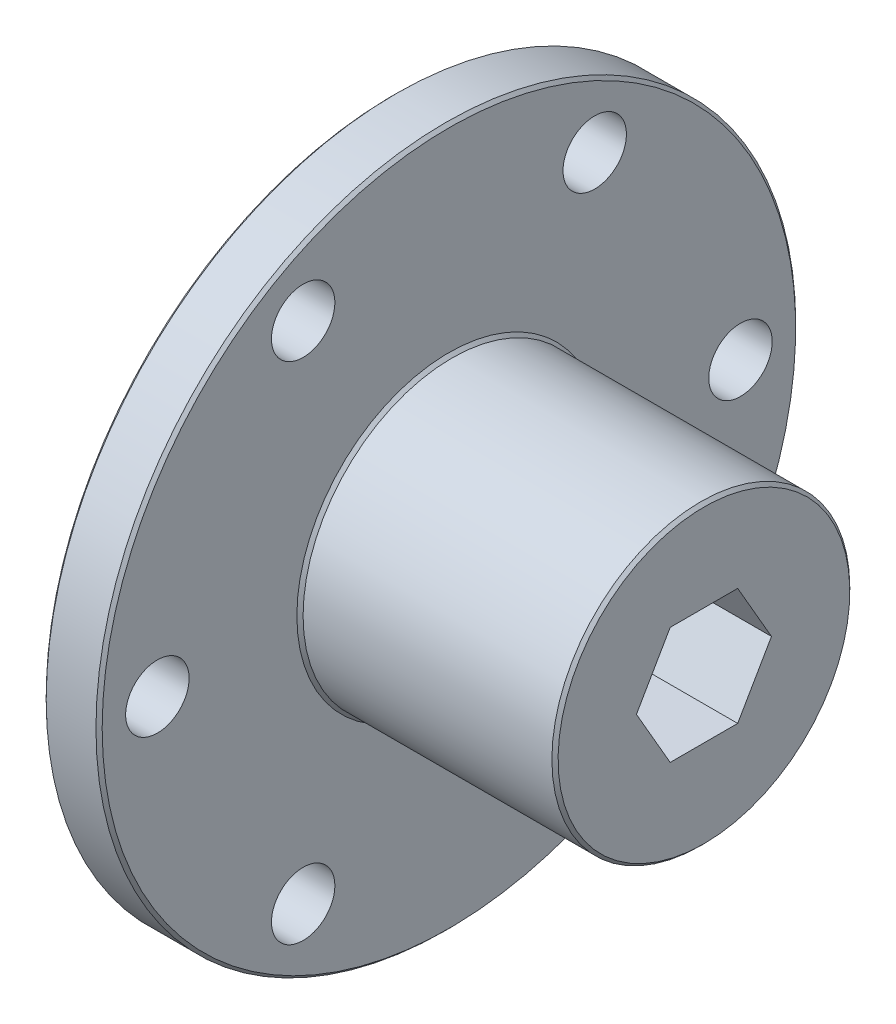
ISO-10303-21;
HEADER;
FILE_DESCRIPTION(('STEP AP214'),'2;1');
FILE_NAME('part.step','',(''),(''),'','','');
FILE_SCHEMA(('AUTOMOTIVE_DESIGN { 1 0 10303 214 1 1 1 1 }'));
ENDSEC;
DATA;
#1=APPLICATION_CONTEXT('core data for automotive mechanical design processes');
#2=APPLICATION_PROTOCOL_DEFINITION('international standard','automotive_design',2000,#1);
#3=PRODUCT_CONTEXT('',#1,'mechanical');
#4=PRODUCT('Part','Part','',(#3));
#5=PRODUCT_RELATED_PRODUCT_CATEGORY('part','',(#4));
#6=PRODUCT_DEFINITION_FORMATION('','',#4);
#7=PRODUCT_DEFINITION_CONTEXT('part definition',#1,'design');
#8=PRODUCT_DEFINITION('design','',#6,#7);
#9=PRODUCT_DEFINITION_SHAPE('','',#8);
#10=(LENGTH_UNIT() NAMED_UNIT(*) SI_UNIT(.MILLI.,.METRE.));
#11=(NAMED_UNIT(*) PLANE_ANGLE_UNIT() SI_UNIT($,.RADIAN.));
#12=(NAMED_UNIT(*) SI_UNIT($,.STERADIAN.) SOLID_ANGLE_UNIT());
#13=UNCERTAINTY_MEASURE_WITH_UNIT(LENGTH_MEASURE(1.E-05),#10,'distance_accuracy_value','');
#14=(GEOMETRIC_REPRESENTATION_CONTEXT(3) GLOBAL_UNCERTAINTY_ASSIGNED_CONTEXT((#13)) GLOBAL_UNIT_ASSIGNED_CONTEXT((#10,
#11,#12)) REPRESENTATION_CONTEXT('',''));
#15=CARTESIAN_POINT('',(0.,0.,0.));
#16=DIRECTION('',(0.,0.,1.));
#17=DIRECTION('',(1.,0.,0.));
#18=AXIS2_PLACEMENT_3D('',#15,#16,#17);
#19=CARTESIAN_POINT('',(7.79293375394323,0.,0.));
#20=DIRECTION('',(-1.,0.,0.));
#21=DIRECTION('',(0.,0.,1.));
#22=AXIS2_PLACEMENT_3D('',#19,#20,#21);
#23=CYLINDRICAL_SURFACE('',#22,12.1666);
#24=CARTESIAN_POINT('',(7.53893375394325,0.,0.));
#25=DIRECTION('',(-1.,0.,0.));
#26=DIRECTION('',(0.,0.,1.));
#27=AXIS2_PLACEMENT_3D('',#24,#25,#26);
#28=CIRCLE('',#27,12.1666);
#29=CARTESIAN_POINT('',(7.53893375394325,0.,12.1666));
#30=VERTEX_POINT('',#29);
#31=EDGE_CURVE('E105',#30,#30,#28,.F.);
#32=ORIENTED_EDGE('',*,*,#31,.F.);
#33=EDGE_LOOP('',(#32));
#34=FACE_BOUND('',#33,.T.);
#35=CARTESIAN_POINT('',(-12.7810662460568,0.,0.));
#36=DIRECTION('',(-1.,0.,0.));
#37=DIRECTION('',(0.,0.,1.));
#38=AXIS2_PLACEMENT_3D('',#35,#36,#37);
#39=CIRCLE('',#38,12.1666);
#40=CARTESIAN_POINT('',(-12.7810662460568,0.,12.1666));
#41=VERTEX_POINT('',#40);
#42=EDGE_CURVE('E102',#41,#41,#39,.T.);
#43=ORIENTED_EDGE('',*,*,#42,.F.);
#44=EDGE_LOOP('',(#43));
#45=FACE_BOUND('',#44,.T.);
#46=ADVANCED_FACE('F16',(#34,#45),#23,.T.);
#47=CARTESIAN_POINT('',(7.53893375394325,0.,0.));
#48=DIRECTION('',(-1.,0.,0.));
#49=DIRECTION('',(0.,-1.,0.));
#50=AXIS2_PLACEMENT_3D('',#47,#48,#49);
#51=CONICAL_SURFACE('',#50,12.1666,0.785398163397443);
#52=ORIENTED_EDGE('',*,*,#31,.T.);
#53=EDGE_LOOP('',(#52));
#54=FACE_BOUND('',#53,.T.);
#55=CARTESIAN_POINT('',(7.79293375394323,0.,0.));
#56=DIRECTION('',(-1.,0.,0.));
#57=DIRECTION('',(0.,-1.,0.));
#58=AXIS2_PLACEMENT_3D('',#55,#56,#57);
#59=CIRCLE('',#58,11.9126);
#60=CARTESIAN_POINT('',(7.79293375394323,-11.9126,0.));
#61=VERTEX_POINT('',#60);
#62=EDGE_CURVE('E19',#61,#61,#59,.F.);
#63=ORIENTED_EDGE('',*,*,#62,.F.);
#64=EDGE_LOOP('',(#63));
#65=FACE_BOUND('',#64,.T.);
#66=ADVANCED_FACE('F154',(#54,#65),#51,.T.);
#67=CARTESIAN_POINT('',(-13.2890662460568,0.,0.));
#68=DIRECTION('',(-1.,0.,0.));
#69=DIRECTION('',(0.,0.,1.));
#70=AXIS2_PLACEMENT_3D('',#67,#68,#69);
#71=CONICAL_SURFACE('',#70,28.575,0.785398163397442);
#72=CARTESIAN_POINT('',(-13.2890662460568,0.,0.));
#73=DIRECTION('',(-1.,0.,0.));
#74=DIRECTION('',(0.,0.,1.));
#75=AXIS2_PLACEMENT_3D('',#72,#73,#74);
#76=CIRCLE('',#75,28.575);
#77=CARTESIAN_POINT('',(-13.2890662460568,0.,28.575));
#78=VERTEX_POINT('',#77);
#79=EDGE_CURVE('E99',#78,#78,#76,.T.);
#80=ORIENTED_EDGE('',*,*,#79,.F.);
#81=EDGE_LOOP('',(#80));
#82=FACE_BOUND('',#81,.T.);
#83=CARTESIAN_POINT('',(-13.0350662460568,0.,0.));
#84=DIRECTION('',(-1.,0.,0.));
#85=DIRECTION('',(0.,0.,1.));
#86=AXIS2_PLACEMENT_3D('',#83,#84,#85);
#87=CIRCLE('',#86,28.321);
#88=CARTESIAN_POINT('',(-13.0350662460568,0.,28.321));
#89=VERTEX_POINT('',#88);
#90=EDGE_CURVE('E147',#89,#89,#87,.F.);
#91=ORIENTED_EDGE('',*,*,#90,.F.);
#92=EDGE_LOOP('',(#91));
#93=FACE_BOUND('',#92,.T.);
#94=ADVANCED_FACE('F156',(#82,#93),#71,.T.);
#95=CARTESIAN_POINT('',(-13.0350662460568,0.,0.));
#96=DIRECTION('',(-1.,0.,0.));
#97=DIRECTION('',(0.,0.,1.));
#98=AXIS2_PLACEMENT_3D('',#95,#96,#97);
#99=CONICAL_SURFACE('',#98,12.4206,0.785398163397448);
#100=ORIENTED_EDGE('',*,*,#42,.T.);
#101=EDGE_LOOP('',(#100));
#102=FACE_BOUND('',#101,.T.);
#103=CARTESIAN_POINT('',(-13.0350662460568,0.,0.));
#104=DIRECTION('',(-1.,0.,0.));
#105=DIRECTION('',(0.,0.,1.));
#106=AXIS2_PLACEMENT_3D('',#103,#104,#105);
#107=CIRCLE('',#106,12.4206);
#108=CARTESIAN_POINT('',(-13.0350662460568,0.,12.4206));
#109=VERTEX_POINT('',#108);
#110=EDGE_CURVE('E98',#109,#109,#107,.T.);
#111=ORIENTED_EDGE('',*,*,#110,.F.);
#112=EDGE_LOOP('',(#111));
#113=FACE_BOUND('',#112,.T.);
#114=ADVANCED_FACE('F163',(#102,#113),#99,.T.);
#115=CARTESIAN_POINT('',(-13.0350662460568,0.,0.));
#116=DIRECTION('',(-1.,0.,0.));
#117=DIRECTION('',(0.,0.,1.));
#118=AXIS2_PLACEMENT_3D('',#115,#116,#117);
#119=CYLINDRICAL_SURFACE('',#118,28.575);
#120=CARTESIAN_POINT('',(-17.3530662460568,0.,0.));
#121=DIRECTION('',(1.,0.,0.));
#122=DIRECTION('',(0.,0.,-1.));
#123=AXIS2_PLACEMENT_3D('',#120,#121,#122);
#124=CIRCLE('',#123,28.575);
#125=CARTESIAN_POINT('',(-17.3530662460568,0.,-28.575));
#126=VERTEX_POINT('',#125);
#127=EDGE_CURVE('E80',#126,#126,#124,.F.);
#128=ORIENTED_EDGE('',*,*,#127,.F.);
#129=EDGE_LOOP('',(#128));
#130=FACE_BOUND('',#129,.T.);
#131=ORIENTED_EDGE('',*,*,#79,.T.);
#132=EDGE_LOOP('',(#131));
#133=FACE_BOUND('',#132,.T.);
#134=ADVANCED_FACE('F229',(#130,#133),#119,.T.);
#135=CARTESIAN_POINT('',(7.79293375394323,0.,0.));
#136=DIRECTION('',(1.,0.,0.));
#137=DIRECTION('',(0.,0.,-1.));
#138=AXIS2_PLACEMENT_3D('',#135,#136,#137);
#139=PLANE('',#138);
#140=DIRECTION('',(0.,0.866025403784438,0.500000000000001));
#141=VECTOR('',#140,1.);
#142=CARTESIAN_POINT('',(7.79293375394324,0.,-5.5139260108686));
#143=LINE('',#142,#141);
#144=CARTESIAN_POINT('',(7.79293375394324,4.7752,-2.7569630054343));
#145=VERTEX_POINT('',#144);
#146=CARTESIAN_POINT('',(7.79293375394323,0.,-5.5139260108686));
#147=VERTEX_POINT('',#146);
#148=EDGE_CURVE('E85',#145,#147,#143,.F.);
#149=ORIENTED_EDGE('',*,*,#148,.T.);
#150=DIRECTION('',(0.,0.866025403784439,-0.5));
#151=VECTOR('',#150,1.);
#152=CARTESIAN_POINT('',(7.79293375394323,-4.7752,-2.7569630054343));
#153=LINE('',#152,#151);
#154=CARTESIAN_POINT('',(7.79293375394323,-4.7752,-2.7569630054343));
#155=VERTEX_POINT('',#154);
#156=EDGE_CURVE('E66',#147,#155,#153,.F.);
#157=ORIENTED_EDGE('',*,*,#156,.T.);
#158=DIRECTION('',(0.,0.,-1.));
#159=VECTOR('',#158,1.);
#160=CARTESIAN_POINT('',(7.79293375394323,-4.7752,2.7569630054343));
#161=LINE('',#160,#159);
#162=CARTESIAN_POINT('',(7.79293375394323,-4.7752,2.7569630054343));
#163=VERTEX_POINT('',#162);
#164=EDGE_CURVE('E71',#155,#163,#161,.F.);
#165=ORIENTED_EDGE('',*,*,#164,.T.);
#166=DIRECTION('',(0.,-0.866025403784439,-0.5));
#167=VECTOR('',#166,1.);
#168=CARTESIAN_POINT('',(7.79293375394323,0.,5.5139260108686));
#169=LINE('',#168,#167);
#170=CARTESIAN_POINT('',(7.79293375394323,0.,5.5139260108686));
#171=VERTEX_POINT('',#170);
#172=EDGE_CURVE('E145',#163,#171,#169,.F.);
#173=ORIENTED_EDGE('',*,*,#172,.T.);
#174=DIRECTION('',(0.,-0.866025403784439,0.5));
#175=VECTOR('',#174,1.);
#176=CARTESIAN_POINT('',(7.79293375394323,4.7752,2.7569630054343));
#177=LINE('',#176,#175);
#178=CARTESIAN_POINT('',(7.79293375394323,4.7752,2.7569630054343));
#179=VERTEX_POINT('',#178);
#180=EDGE_CURVE('E414',#171,#179,#177,.F.);
#181=ORIENTED_EDGE('',*,*,#180,.T.);
#182=DIRECTION('',(0.,0.,1.));
#183=VECTOR('',#182,1.);
#184=CARTESIAN_POINT('',(7.79293375394323,4.7752,-2.7569630054343));
#185=LINE('',#184,#183);
#186=EDGE_CURVE('E419',#179,#145,#185,.F.);
#187=ORIENTED_EDGE('',*,*,#186,.T.);
#188=EDGE_LOOP('',(#149,#157,#165,#173,#181,#187));
#189=FACE_BOUND('',#188,.T.);
#190=ORIENTED_EDGE('',*,*,#62,.T.);
#191=EDGE_LOOP('',(#190));
#192=FACE_BOUND('',#191,.T.);
#193=ADVANCED_FACE('F82',(#189,#192),#139,.T.);
#194=CARTESIAN_POINT('',(-13.0350662460568,28.575,0.));
#195=DIRECTION('',(1.,0.,0.));
#196=DIRECTION('',(0.,0.,-1.));
#197=AXIS2_PLACEMENT_3D('',#194,#195,#196);
#198=PLANE('',#197);
#199=CARTESIAN_POINT('',(-13.0350662460568,0.,23.8125));
#200=DIRECTION('',(1.,0.,0.));
#201=DIRECTION('',(0.,0.,-1.));
#202=AXIS2_PLACEMENT_3D('',#199,#200,#201);
#203=CIRCLE('',#202,2.59080000000001);
#204=CARTESIAN_POINT('',(-13.0350662460568,0.,21.2217));
#205=VERTEX_POINT('',#204);
#206=EDGE_CURVE('E127',#205,#205,#203,.F.);
#207=ORIENTED_EDGE('',*,*,#206,.T.);
#208=EDGE_LOOP('',(#207));
#209=FACE_BOUND('',#208,.T.);
#210=CARTESIAN_POINT('',(-13.0350662460568,20.6222299276169,11.90625));
#211=DIRECTION('',(1.,0.,0.));
#212=DIRECTION('',(0.,0.,-1.));
#213=AXIS2_PLACEMENT_3D('',#210,#211,#212);
#214=CIRCLE('',#213,2.59080000000001);
#215=CARTESIAN_POINT('',(-13.0350662460568,20.6222299276169,9.31544999999999));
#216=VERTEX_POINT('',#215);
#217=EDGE_CURVE('E130',#216,#216,#214,.F.);
#218=ORIENTED_EDGE('',*,*,#217,.T.);
#219=EDGE_LOOP('',(#218));
#220=FACE_BOUND('',#219,.T.);
#221=CARTESIAN_POINT('',(-13.0350662460568,20.622229927617,-11.90625));
#222=DIRECTION('',(1.,0.,0.));
#223=DIRECTION('',(0.,0.,-1.));
#224=AXIS2_PLACEMENT_3D('',#221,#222,#223);
#225=CIRCLE('',#224,2.59080000000001);
#226=CARTESIAN_POINT('',(-13.0350662460568,20.622229927617,-14.49705));
#227=VERTEX_POINT('',#226);
#228=EDGE_CURVE('E133',#227,#227,#225,.F.);
#229=ORIENTED_EDGE('',*,*,#228,.T.);
#230=EDGE_LOOP('',(#229));
#231=FACE_BOUND('',#230,.T.);
#232=CARTESIAN_POINT('',(-13.0350662460568,0.,-23.8125));
#233=DIRECTION('',(1.,0.,0.));
#234=DIRECTION('',(0.,0.,-1.));
#235=AXIS2_PLACEMENT_3D('',#232,#233,#234);
#236=CIRCLE('',#235,2.59080000000001);
#237=CARTESIAN_POINT('',(-13.0350662460568,0.,-26.4033));
#238=VERTEX_POINT('',#237);
#239=EDGE_CURVE('E136',#238,#238,#236,.F.);
#240=ORIENTED_EDGE('',*,*,#239,.T.);
#241=EDGE_LOOP('',(#240));
#242=FACE_BOUND('',#241,.T.);
#243=CARTESIAN_POINT('',(-13.0350662460568,-20.6222299276169,-11.90625));
#244=DIRECTION('',(1.,0.,0.));
#245=DIRECTION('',(0.,0.,-1.));
#246=AXIS2_PLACEMENT_3D('',#243,#244,#245);
#247=CIRCLE('',#246,2.59080000000001);
#248=CARTESIAN_POINT('',(-13.0350662460568,-20.6222299276169,-14.4970500000001));
#249=VERTEX_POINT('',#248);
#250=EDGE_CURVE('E139',#249,#249,#247,.F.);
#251=ORIENTED_EDGE('',*,*,#250,.T.);
#252=EDGE_LOOP('',(#251));
#253=FACE_BOUND('',#252,.T.);
#254=CARTESIAN_POINT('',(-13.0350662460568,-20.622229927617,11.9062499999999));
#255=DIRECTION('',(1.,0.,0.));
#256=DIRECTION('',(0.,0.,-1.));
#257=AXIS2_PLACEMENT_3D('',#254,#255,#256);
#258=CIRCLE('',#257,2.59080000000001);
#259=CARTESIAN_POINT('',(-13.0350662460568,-20.622229927617,9.31544999999993));
#260=VERTEX_POINT('',#259);
#261=EDGE_CURVE('E142',#260,#260,#258,.F.);
#262=ORIENTED_EDGE('',*,*,#261,.T.);
#263=EDGE_LOOP('',(#262));
#264=FACE_BOUND('',#263,.T.);
#265=ORIENTED_EDGE('',*,*,#110,.T.);
#266=EDGE_LOOP('',(#265));
#267=FACE_BOUND('',#266,.T.);
#268=ORIENTED_EDGE('',*,*,#90,.T.);
#269=EDGE_LOOP('',(#268));
#270=FACE_BOUND('',#269,.T.);
#271=ADVANCED_FACE('F222',(#209,#220,#231,#242,#253,#264,#267,#270),#198,.T.);
#272=CARTESIAN_POINT('',(-17.3530662460568,0.,0.));
#273=DIRECTION('',(1.,0.,0.));
#274=DIRECTION('',(0.,0.,-1.));
#275=AXIS2_PLACEMENT_3D('',#272,#273,#274);
#276=CONICAL_SURFACE('',#275,28.575,0.785398163397455);
#277=ORIENTED_EDGE('',*,*,#127,.T.);
#278=EDGE_LOOP('',(#277));
#279=FACE_BOUND('',#278,.T.);
#280=CARTESIAN_POINT('',(-17.6070662460568,0.,0.));
#281=DIRECTION('',(1.,0.,0.));
#282=DIRECTION('',(0.,0.,-1.));
#283=AXIS2_PLACEMENT_3D('',#280,#281,#282);
#284=CIRCLE('',#283,28.321);
#285=CARTESIAN_POINT('',(-17.6070662460568,0.,-28.321));
#286=VERTEX_POINT('',#285);
#287=EDGE_CURVE('E123',#286,#286,#284,.F.);
#288=ORIENTED_EDGE('',*,*,#287,.F.);
#289=EDGE_LOOP('',(#288));
#290=FACE_BOUND('',#289,.T.);
#291=ADVANCED_FACE('F219',(#279,#290),#276,.T.);
#292=CARTESIAN_POINT('',(-17.6070662460568,-4.7752,2.7569630054343));
#293=DIRECTION('',(0.,-1.,0.));
#294=DIRECTION('',(0.,0.,-1.));
#295=AXIS2_PLACEMENT_3D('',#292,#293,#294);
#296=PLANE('',#295);
#297=DIRECTION('',(1.,0.,0.));
#298=VECTOR('',#297,1.);
#299=CARTESIAN_POINT('',(-17.6070662460568,-4.7752,-2.7569630054343));
#300=LINE('',#299,#298);
#301=CARTESIAN_POINT('',(-17.6070662460568,-4.7752,-2.7569630054343));
#302=VERTEX_POINT('',#301);
#303=EDGE_CURVE('E73',#155,#302,#300,.F.);
#304=ORIENTED_EDGE('',*,*,#303,.T.);
#305=DIRECTION('',(0.,0.,1.));
#306=VECTOR('',#305,1.);
#307=CARTESIAN_POINT('',(-17.6070662460568,-4.7752,0.));
#308=LINE('',#307,#306);
#309=CARTESIAN_POINT('',(-17.6070662460568,-4.7752,2.7569630054343));
#310=VERTEX_POINT('',#309);
#311=EDGE_CURVE('E126',#310,#302,#308,.F.);
#312=ORIENTED_EDGE('',*,*,#311,.F.);
#313=DIRECTION('',(1.,0.,0.));
#314=VECTOR('',#313,1.);
#315=CARTESIAN_POINT('',(-17.6070662460568,-4.7752,2.7569630054343));
#316=LINE('',#315,#314);
#317=EDGE_CURVE('E76',#310,#163,#316,.T.);
#318=ORIENTED_EDGE('',*,*,#317,.T.);
#319=ORIENTED_EDGE('',*,*,#164,.F.);
#320=EDGE_LOOP('',(#304,#312,#318,#319));
#321=FACE_BOUND('',#320,.T.);
#322=ADVANCED_FACE('F72',(#321),#296,.F.);
#323=CARTESIAN_POINT('',(-17.6070662460568,-4.7752,-2.7569630054343));
#324=DIRECTION('',(0.,-0.5,-0.866025403784439));
#325=DIRECTION('',(0.,0.866025403784439,-0.5));
#326=AXIS2_PLACEMENT_3D('',#323,#324,#325);
#327=PLANE('',#326);
#328=DIRECTION('',(1.,0.,0.));
#329=VECTOR('',#328,1.);
#330=CARTESIAN_POINT('',(-17.6070662460568,0.,-5.5139260108686));
#331=LINE('',#330,#329);
#332=CARTESIAN_POINT('',(-17.6070662460568,0.,-5.5139260108686));
#333=VERTEX_POINT('',#332);
#334=EDGE_CURVE('E87',#147,#333,#331,.F.);
#335=ORIENTED_EDGE('',*,*,#334,.T.);
#336=DIRECTION('',(0.,0.866025403784439,-0.5));
#337=VECTOR('',#336,1.);
#338=CARTESIAN_POINT('',(-17.6070662460568,-4.7752,-2.7569630054343));
#339=LINE('',#338,#337);
#340=EDGE_CURVE('E91',#302,#333,#339,.T.);
#341=ORIENTED_EDGE('',*,*,#340,.F.);
#342=ORIENTED_EDGE('',*,*,#303,.F.);
#343=ORIENTED_EDGE('',*,*,#156,.F.);
#344=EDGE_LOOP('',(#335,#341,#342,#343));
#345=FACE_BOUND('',#344,.T.);
#346=ADVANCED_FACE('F89',(#345),#327,.F.);
#347=CARTESIAN_POINT('',(-17.6070662460568,0.,-5.5139260108686));
#348=DIRECTION('',(0.,0.500000000000001,-0.866025403784438));
#349=DIRECTION('',(0.,0.866025403784438,0.500000000000001));
#350=AXIS2_PLACEMENT_3D('',#347,#348,#349);
#351=PLANE('',#350);
#352=DIRECTION('',(1.,0.,0.));
#353=VECTOR('',#352,1.);
#354=CARTESIAN_POINT('',(-17.6070662460568,4.7752,-2.7569630054343));
#355=LINE('',#354,#353);
#356=CARTESIAN_POINT('',(-17.6070662460568,4.7752,-2.7569630054343));
#357=VERTEX_POINT('',#356);
#358=EDGE_CURVE('E421',#145,#357,#355,.F.);
#359=ORIENTED_EDGE('',*,*,#358,.T.);
#360=DIRECTION('',(0.,0.866025403784438,0.5));
#361=VECTOR('',#360,1.);
#362=CARTESIAN_POINT('',(-17.6070662460568,0.,-5.5139260108686));
#363=LINE('',#362,#361);
#364=EDGE_CURVE('E405',#333,#357,#363,.T.);
#365=ORIENTED_EDGE('',*,*,#364,.F.);
#366=ORIENTED_EDGE('',*,*,#334,.F.);
#367=ORIENTED_EDGE('',*,*,#148,.F.);
#368=EDGE_LOOP('',(#359,#365,#366,#367));
#369=FACE_BOUND('',#368,.T.);
#370=ADVANCED_FACE('F210',(#369),#351,.F.);
#371=CARTESIAN_POINT('',(-17.6070662460568,4.7752,-2.7569630054343));
#372=DIRECTION('',(0.,1.,0.));
#373=DIRECTION('',(0.,0.,1.));
#374=AXIS2_PLACEMENT_3D('',#371,#372,#373);
#375=PLANE('',#374);
#376=DIRECTION('',(1.,0.,0.));
#377=VECTOR('',#376,1.);
#378=CARTESIAN_POINT('',(-17.6070662460568,4.7752,2.7569630054343));
#379=LINE('',#378,#377);
#380=CARTESIAN_POINT('',(-17.6070662460568,4.7752,2.7569630054343));
#381=VERTEX_POINT('',#380);
#382=EDGE_CURVE('E417',#179,#381,#379,.F.);
#383=ORIENTED_EDGE('',*,*,#382,.T.);
#384=DIRECTION('',(0.,0.,1.));
#385=VECTOR('',#384,1.);
#386=CARTESIAN_POINT('',(-17.6070662460568,4.7752,0.));
#387=LINE('',#386,#385);
#388=EDGE_CURVE('E401',#357,#381,#387,.T.);
#389=ORIENTED_EDGE('',*,*,#388,.F.);
#390=ORIENTED_EDGE('',*,*,#358,.F.);
#391=ORIENTED_EDGE('',*,*,#186,.F.);
#392=EDGE_LOOP('',(#383,#389,#390,#391));
#393=FACE_BOUND('',#392,.T.);
#394=ADVANCED_FACE('F207',(#393),#375,.F.);
#395=CARTESIAN_POINT('',(-17.6070662460568,4.7752,2.7569630054343));
#396=DIRECTION('',(0.,0.5,0.866025403784439));
#397=DIRECTION('',(0.,-0.866025403784439,0.5));
#398=AXIS2_PLACEMENT_3D('',#395,#396,#397);
#399=PLANE('',#398);
#400=DIRECTION('',(1.,0.,0.));
#401=VECTOR('',#400,1.);
#402=CARTESIAN_POINT('',(-17.6070662460568,0.,5.5139260108686));
#403=LINE('',#402,#401);
#404=CARTESIAN_POINT('',(-17.6070662460568,0.,5.5139260108686));
#405=VERTEX_POINT('',#404);
#406=EDGE_CURVE('E34',#171,#405,#403,.F.);
#407=ORIENTED_EDGE('',*,*,#406,.T.);
#408=DIRECTION('',(0.,-0.866025403784439,0.5));
#409=VECTOR('',#408,1.);
#410=CARTESIAN_POINT('',(-17.6070662460568,4.7752,2.7569630054343));
#411=LINE('',#410,#409);
#412=EDGE_CURVE('E398',#381,#405,#411,.T.);
#413=ORIENTED_EDGE('',*,*,#412,.F.);
#414=ORIENTED_EDGE('',*,*,#382,.F.);
#415=ORIENTED_EDGE('',*,*,#180,.F.);
#416=EDGE_LOOP('',(#407,#413,#414,#415));
#417=FACE_BOUND('',#416,.T.);
#418=ADVANCED_FACE('F203',(#417),#399,.F.);
#419=CARTESIAN_POINT('',(-17.6070662460568,0.,5.5139260108686));
#420=DIRECTION('',(0.,-0.5,0.866025403784439));
#421=DIRECTION('',(0.,-0.866025403784439,-0.5));
#422=AXIS2_PLACEMENT_3D('',#419,#420,#421);
#423=PLANE('',#422);
#424=ORIENTED_EDGE('',*,*,#317,.F.);
#425=DIRECTION('',(0.,-0.866025403784439,-0.5));
#426=VECTOR('',#425,1.);
#427=CARTESIAN_POINT('',(-17.6070662460568,0.,5.5139260108686));
#428=LINE('',#427,#426);
#429=EDGE_CURVE('E122',#405,#310,#428,.T.);
#430=ORIENTED_EDGE('',*,*,#429,.F.);
#431=ORIENTED_EDGE('',*,*,#406,.F.);
#432=ORIENTED_EDGE('',*,*,#172,.F.);
#433=EDGE_LOOP('',(#424,#430,#431,#432));
#434=FACE_BOUND('',#433,.T.);
#435=ADVANCED_FACE('F199',(#434),#423,.F.);
#436=CARTESIAN_POINT('',(-13.0350662460568,-20.622229927617,11.9062499999999));
#437=DIRECTION('',(1.,0.,0.));
#438=DIRECTION('',(0.,0.,-1.));
#439=AXIS2_PLACEMENT_3D('',#436,#437,#438);
#440=CYLINDRICAL_SURFACE('',#439,2.59080000000001);
#441=ORIENTED_EDGE('',*,*,#261,.F.);
#442=EDGE_LOOP('',(#441));
#443=FACE_BOUND('',#442,.T.);
#444=CARTESIAN_POINT('',(-17.6070662460568,-20.622229927617,11.9062499999999));
#445=DIRECTION('',(1.,0.,0.));
#446=DIRECTION('',(0.,0.,-1.));
#447=AXIS2_PLACEMENT_3D('',#444,#445,#446);
#448=CIRCLE('',#447,2.59080000000001);
#449=CARTESIAN_POINT('',(-17.6070662460568,-20.622229927617,9.31544999999993));
#450=VERTEX_POINT('',#449);
#451=EDGE_CURVE('E119',#450,#450,#448,.T.);
#452=ORIENTED_EDGE('',*,*,#451,.F.);
#453=EDGE_LOOP('',(#452));
#454=FACE_BOUND('',#453,.T.);
#455=ADVANCED_FACE('F195',(#443,#454),#440,.F.);
#456=CARTESIAN_POINT('',(-13.0350662460568,-20.6222299276169,-11.90625));
#457=DIRECTION('',(1.,0.,0.));
#458=DIRECTION('',(0.,0.,-1.));
#459=AXIS2_PLACEMENT_3D('',#456,#457,#458);
#460=CYLINDRICAL_SURFACE('',#459,2.59080000000001);
#461=ORIENTED_EDGE('',*,*,#250,.F.);
#462=EDGE_LOOP('',(#461));
#463=FACE_BOUND('',#462,.T.);
#464=CARTESIAN_POINT('',(-17.6070662460568,-20.6222299276169,-11.90625));
#465=DIRECTION('',(1.,0.,0.));
#466=DIRECTION('',(0.,0.,-1.));
#467=AXIS2_PLACEMENT_3D('',#464,#465,#466);
#468=CIRCLE('',#467,2.59080000000001);
#469=CARTESIAN_POINT('',(-17.6070662460568,-20.6222299276169,-14.4970500000001));
#470=VERTEX_POINT('',#469);
#471=EDGE_CURVE('E116',#470,#470,#468,.T.);
#472=ORIENTED_EDGE('',*,*,#471,.F.);
#473=EDGE_LOOP('',(#472));
#474=FACE_BOUND('',#473,.T.);
#475=ADVANCED_FACE('F191',(#463,#474),#460,.F.);
#476=CARTESIAN_POINT('',(-13.0350662460568,0.,-23.8125));
#477=DIRECTION('',(1.,0.,0.));
#478=DIRECTION('',(0.,0.,-1.));
#479=AXIS2_PLACEMENT_3D('',#476,#477,#478);
#480=CYLINDRICAL_SURFACE('',#479,2.59080000000001);
#481=ORIENTED_EDGE('',*,*,#239,.F.);
#482=EDGE_LOOP('',(#481));
#483=FACE_BOUND('',#482,.T.);
#484=CARTESIAN_POINT('',(-17.6070662460568,0.,-23.8125));
#485=DIRECTION('',(1.,0.,0.));
#486=DIRECTION('',(0.,0.,-1.));
#487=AXIS2_PLACEMENT_3D('',#484,#485,#486);
#488=CIRCLE('',#487,2.59080000000001);
#489=CARTESIAN_POINT('',(-17.6070662460568,0.,-26.4033));
#490=VERTEX_POINT('',#489);
#491=EDGE_CURVE('E113',#490,#490,#488,.T.);
#492=ORIENTED_EDGE('',*,*,#491,.F.);
#493=EDGE_LOOP('',(#492));
#494=FACE_BOUND('',#493,.T.);
#495=ADVANCED_FACE('F187',(#483,#494),#480,.F.);
#496=CARTESIAN_POINT('',(-13.0350662460568,20.622229927617,-11.90625));
#497=DIRECTION('',(1.,0.,0.));
#498=DIRECTION('',(0.,0.,-1.));
#499=AXIS2_PLACEMENT_3D('',#496,#497,#498);
#500=CYLINDRICAL_SURFACE('',#499,2.59080000000001);
#501=ORIENTED_EDGE('',*,*,#228,.F.);
#502=EDGE_LOOP('',(#501));
#503=FACE_BOUND('',#502,.T.);
#504=CARTESIAN_POINT('',(-17.6070662460568,20.622229927617,-11.90625));
#505=DIRECTION('',(1.,0.,0.));
#506=DIRECTION('',(0.,0.,-1.));
#507=AXIS2_PLACEMENT_3D('',#504,#505,#506);
#508=CIRCLE('',#507,2.59080000000001);
#509=CARTESIAN_POINT('',(-17.6070662460568,20.622229927617,-14.49705));
#510=VERTEX_POINT('',#509);
#511=EDGE_CURVE('E110',#510,#510,#508,.T.);
#512=ORIENTED_EDGE('',*,*,#511,.F.);
#513=EDGE_LOOP('',(#512));
#514=FACE_BOUND('',#513,.T.);
#515=ADVANCED_FACE('F183',(#503,#514),#500,.F.);
#516=CARTESIAN_POINT('',(-13.0350662460568,20.6222299276169,11.90625));
#517=DIRECTION('',(1.,0.,0.));
#518=DIRECTION('',(0.,0.,-1.));
#519=AXIS2_PLACEMENT_3D('',#516,#517,#518);
#520=CYLINDRICAL_SURFACE('',#519,2.59080000000001);
#521=ORIENTED_EDGE('',*,*,#217,.F.);
#522=EDGE_LOOP('',(#521));
#523=FACE_BOUND('',#522,.T.);
#524=CARTESIAN_POINT('',(-17.6070662460568,20.6222299276169,11.90625));
#525=DIRECTION('',(1.,0.,0.));
#526=DIRECTION('',(0.,0.,-1.));
#527=AXIS2_PLACEMENT_3D('',#524,#525,#526);
#528=CIRCLE('',#527,2.59080000000001);
#529=CARTESIAN_POINT('',(-17.6070662460568,20.6222299276169,9.31544999999999));
#530=VERTEX_POINT('',#529);
#531=EDGE_CURVE('E25',#530,#530,#528,.T.);
#532=ORIENTED_EDGE('',*,*,#531,.F.);
#533=EDGE_LOOP('',(#532));
#534=FACE_BOUND('',#533,.T.);
#535=ADVANCED_FACE('F176',(#523,#534),#520,.F.);
#536=CARTESIAN_POINT('',(-13.0350662460568,0.,23.8125));
#537=DIRECTION('',(1.,0.,0.));
#538=DIRECTION('',(0.,0.,-1.));
#539=AXIS2_PLACEMENT_3D('',#536,#537,#538);
#540=CYLINDRICAL_SURFACE('',#539,2.59080000000001);
#541=ORIENTED_EDGE('',*,*,#206,.F.);
#542=EDGE_LOOP('',(#541));
#543=FACE_BOUND('',#542,.T.);
#544=CARTESIAN_POINT('',(-17.6070662460568,0.,23.8125));
#545=DIRECTION('',(1.,0.,0.));
#546=DIRECTION('',(0.,0.,-1.));
#547=AXIS2_PLACEMENT_3D('',#544,#545,#546);
#548=CIRCLE('',#547,2.59080000000001);
#549=CARTESIAN_POINT('',(-17.6070662460568,0.,21.2217));
#550=VERTEX_POINT('',#549);
#551=EDGE_CURVE('E11',#550,#550,#548,.T.);
#552=ORIENTED_EDGE('',*,*,#551,.F.);
#553=EDGE_LOOP('',(#552));
#554=FACE_BOUND('',#553,.T.);
#555=ADVANCED_FACE('F170',(#543,#554),#540,.F.);
#556=CARTESIAN_POINT('',(-17.6070662460568,0.,0.));
#557=DIRECTION('',(-1.,0.,0.));
#558=DIRECTION('',(0.,0.,1.));
#559=AXIS2_PLACEMENT_3D('',#556,#557,#558);
#560=PLANE('',#559);
#561=ORIENTED_EDGE('',*,*,#551,.T.);
#562=EDGE_LOOP('',(#561));
#563=FACE_BOUND('',#562,.T.);
#564=ORIENTED_EDGE('',*,*,#531,.T.);
#565=EDGE_LOOP('',(#564));
#566=FACE_BOUND('',#565,.T.);
#567=ORIENTED_EDGE('',*,*,#511,.T.);
#568=EDGE_LOOP('',(#567));
#569=FACE_BOUND('',#568,.T.);
#570=ORIENTED_EDGE('',*,*,#491,.T.);
#571=EDGE_LOOP('',(#570));
#572=FACE_BOUND('',#571,.T.);
#573=ORIENTED_EDGE('',*,*,#471,.T.);
#574=EDGE_LOOP('',(#573));
#575=FACE_BOUND('',#574,.T.);
#576=ORIENTED_EDGE('',*,*,#451,.T.);
#577=EDGE_LOOP('',(#576));
#578=FACE_BOUND('',#577,.T.);
#579=ORIENTED_EDGE('',*,*,#412,.T.);
#580=ORIENTED_EDGE('',*,*,#429,.T.);
#581=ORIENTED_EDGE('',*,*,#311,.T.);
#582=ORIENTED_EDGE('',*,*,#340,.T.);
#583=ORIENTED_EDGE('',*,*,#364,.T.);
#584=ORIENTED_EDGE('',*,*,#388,.T.);
#585=EDGE_LOOP('',(#579,#580,#581,#582,#583,#584));
#586=FACE_BOUND('',#585,.T.);
#587=ORIENTED_EDGE('',*,*,#287,.T.);
#588=EDGE_LOOP('',(#587));
#589=FACE_BOUND('',#588,.T.);
#590=ADVANCED_FACE('F168',(#563,#566,#569,#572,#575,#578,#586,#589),#560,.T.);
#591=CLOSED_SHELL('',(#46,#66,#94,#114,#134,#193,#271,#291,#322,#346,#370,#394,#418,#435,#455,
#475,#495,#515,#535,#555,#590));
#592=MANIFOLD_SOLID_BREP('B1',#591);
#593=ADVANCED_BREP_SHAPE_REPRESENTATION('',(#18,#592),#14);
#594=SHAPE_DEFINITION_REPRESENTATION(#9,#593);
ENDSEC;
END-ISO-10303-21;
